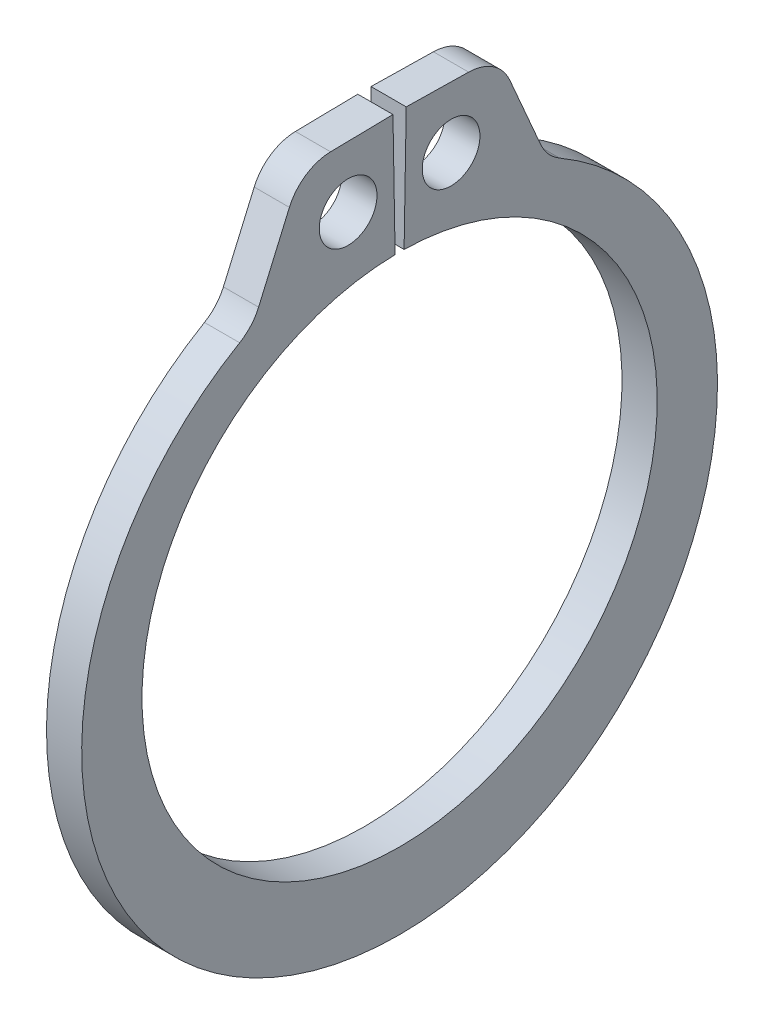
ISO-10303-21;
HEADER;
FILE_DESCRIPTION(('STEP AP214'),'2;1');
FILE_NAME('part.step','',(''),(''),'','','');
FILE_SCHEMA(('AUTOMOTIVE_DESIGN { 1 0 10303 214 1 1 1 1 }'));
ENDSEC;
DATA;
#1=APPLICATION_CONTEXT('core data for automotive mechanical design processes');
#2=APPLICATION_PROTOCOL_DEFINITION('international standard','automotive_design',2000,#1);
#3=PRODUCT_CONTEXT('',#1,'mechanical');
#4=PRODUCT('Part','Part','',(#3));
#5=PRODUCT_RELATED_PRODUCT_CATEGORY('part','',(#4));
#6=PRODUCT_DEFINITION_FORMATION('','',#4);
#7=PRODUCT_DEFINITION_CONTEXT('part definition',#1,'design');
#8=PRODUCT_DEFINITION('design','',#6,#7);
#9=PRODUCT_DEFINITION_SHAPE('','',#8);
#10=(LENGTH_UNIT() NAMED_UNIT(*) SI_UNIT(.MILLI.,.METRE.));
#11=(NAMED_UNIT(*) PLANE_ANGLE_UNIT() SI_UNIT($,.RADIAN.));
#12=(NAMED_UNIT(*) SI_UNIT($,.STERADIAN.) SOLID_ANGLE_UNIT());
#13=UNCERTAINTY_MEASURE_WITH_UNIT(LENGTH_MEASURE(1.E-05),#10,'distance_accuracy_value','');
#14=(GEOMETRIC_REPRESENTATION_CONTEXT(3) GLOBAL_UNCERTAINTY_ASSIGNED_CONTEXT((#13)) GLOBAL_UNIT_ASSIGNED_CONTEXT((#10,
#11,#12)) REPRESENTATION_CONTEXT('',''));
#15=CARTESIAN_POINT('',(0.,0.,0.));
#16=DIRECTION('',(0.,0.,1.));
#17=DIRECTION('',(1.,0.,0.));
#18=AXIS2_PLACEMENT_3D('',#15,#16,#17);
#19=CARTESIAN_POINT('',(0.3175,0.,0.));
#20=DIRECTION('',(1.,0.,0.));
#21=DIRECTION('',(0.,0.,-1.));
#22=AXIS2_PLACEMENT_3D('',#19,#20,#21);
#23=PLANE('',#22);
#24=CARTESIAN_POINT('',(0.3175,5.73776140209981,0.92895422825804));
#25=DIRECTION('',(1.,0.,0.));
#26=DIRECTION('',(0.,0.,-1.));
#27=AXIS2_PLACEMENT_3D('',#24,#25,#26);
#28=CIRCLE('',#27,0.5207);
#29=CARTESIAN_POINT('',(0.3175,5.73776140209981,0.40825422825804));
#30=VERTEX_POINT('',#29);
#31=EDGE_CURVE('E225',#30,#30,#28,.T.);
#32=ORIENTED_EDGE('',*,*,#31,.F.);
#33=EDGE_LOOP('',(#32));
#34=FACE_BOUND('',#33,.T.);
#35=DIRECTION('',(0.,-0.0174524064372746,0.999847695156391));
#36=VECTOR('',#35,1.);
#37=CARTESIAN_POINT('',(0.3175,6.85695549338253,0.11968860334689));
#38=LINE('',#37,#36);
#39=CARTESIAN_POINT('',(0.3175,6.85695549338253,0.11968860334689));
#40=VERTEX_POINT('',#39);
#41=CARTESIAN_POINT('',(0.3175,6.83730746393553,1.24532345648589));
#42=VERTEX_POINT('',#41);
#43=EDGE_CURVE('E137',#40,#42,#38,.T.);
#44=ORIENTED_EDGE('',*,*,#43,.T.);
#45=CARTESIAN_POINT('',(0.3175,6.01193319158393,1.23091649497192));
#46=DIRECTION('',(1.,0.,0.));
#47=DIRECTION('',(0.,0.,-1.));
#48=AXIS2_PLACEMENT_3D('',#45,#46,#47);
#49=CIRCLE('',#48,0.8255);
#50=CARTESIAN_POINT('',(0.3175,6.34036860190848,1.98826742502017));
#51=VERTEX_POINT('',#50);
#52=EDGE_CURVE('E178',#42,#51,#49,.T.);
#53=ORIENTED_EDGE('',*,*,#52,.T.);
#54=DIRECTION('',(0.,-0.917445099997873,0.397862398939498));
#55=VECTOR('',#54,1.);
#56=CARTESIAN_POINT('',(0.3175,6.82803074757371,1.77678618091434));
#57=LINE('',#56,#55);
#58=CARTESIAN_POINT('',(0.3175,5.05860230061111,2.54412260972295));
#59=VERTEX_POINT('',#58);
#60=EDGE_CURVE('E217',#51,#59,#57,.T.);
#61=ORIENTED_EDGE('',*,*,#60,.T.);
#62=CARTESIAN_POINT('',(0.3175,5.38703771093567,3.30147353977119));
#63=DIRECTION('',(1.,0.,0.));
#64=DIRECTION('',(0.,0.,-1.));
#65=AXIS2_PLACEMENT_3D('',#62,#63,#64);
#66=CIRCLE('',#65,0.8255);
#67=CARTESIAN_POINT('',(0.3175,4.6736380727081,2.88612885619287));
#68=VERTEX_POINT('',#67);
#69=EDGE_CURVE('E185',#59,#68,#66,.F.);
#70=ORIENTED_EDGE('',*,*,#69,.T.);
#71=CARTESIAN_POINT('',(0.3175,-0.283601933706637,0.));
#72=DIRECTION('',(1.,0.,0.));
#73=DIRECTION('',(0.,0.,-1.));
#74=AXIS2_PLACEMENT_3D('',#71,#72,#73);
#75=CIRCLE('',#74,5.73619806629338);
#76=CARTESIAN_POINT('',(0.3175,4.6736380727081,-2.88612885619287));
#77=VERTEX_POINT('',#76);
#78=EDGE_CURVE('E210',#68,#77,#75,.T.);
#79=ORIENTED_EDGE('',*,*,#78,.T.);
#80=CARTESIAN_POINT('',(0.3175,5.38703771093567,-3.30147353977119));
#81=DIRECTION('',(1.,0.,0.));
#82=DIRECTION('',(0.,0.,-1.));
#83=AXIS2_PLACEMENT_3D('',#80,#81,#82);
#84=CIRCLE('',#83,0.8255);
#85=CARTESIAN_POINT('',(0.3175,5.05860230061111,-2.54412260972295));
#86=VERTEX_POINT('',#85);
#87=EDGE_CURVE('E11',#77,#86,#84,.F.);
#88=ORIENTED_EDGE('',*,*,#87,.T.);
#89=DIRECTION('',(0.,0.917445099997873,0.397862398939498));
#90=VECTOR('',#89,1.);
#91=CARTESIAN_POINT('',(0.3175,6.82803074757371,-1.77678618091434));
#92=LINE('',#91,#90);
#93=CARTESIAN_POINT('',(0.3175,6.34036860190848,-1.98826742502017));
#94=VERTEX_POINT('',#93);
#95=EDGE_CURVE('E209',#86,#94,#92,.T.);
#96=ORIENTED_EDGE('',*,*,#95,.T.);
#97=CARTESIAN_POINT('',(0.3175,6.01193319158393,-1.23091649497192));
#98=DIRECTION('',(1.,0.,0.));
#99=DIRECTION('',(0.,0.,-1.));
#100=AXIS2_PLACEMENT_3D('',#97,#98,#99);
#101=CIRCLE('',#100,0.8255);
#102=CARTESIAN_POINT('',(0.3175,6.83730746393553,-1.24532345648589));
#103=VERTEX_POINT('',#102);
#104=EDGE_CURVE('E53',#94,#103,#101,.T.);
#105=ORIENTED_EDGE('',*,*,#104,.T.);
#106=DIRECTION('',(0.,0.0174524064372746,0.999847695156391));
#107=VECTOR('',#106,1.);
#108=CARTESIAN_POINT('',(0.3175,6.85695549338253,-0.11968860334689));
#109=LINE('',#108,#107);
#110=CARTESIAN_POINT('',(0.3175,6.85695549338253,-0.11968860334689));
#111=VERTEX_POINT('',#110);
#112=EDGE_CURVE('E214',#103,#111,#109,.T.);
#113=ORIENTED_EDGE('',*,*,#112,.T.);
#114=DIRECTION('',(0.,-0.999847695156391,0.0174524064372834));
#115=VECTOR('',#114,1.);
#116=CARTESIAN_POINT('',(0.3175,4.64749205662594,-0.0811222756017817));
#117=LINE('',#116,#115);
#118=CARTESIAN_POINT('',(0.3175,4.64749205662594,-0.0811222756017817));
#119=VERTEX_POINT('',#118);
#120=EDGE_CURVE('E143',#111,#119,#117,.T.);
#121=ORIENTED_EDGE('',*,*,#120,.T.);
#122=CARTESIAN_POINT('',(0.3175,0.,0.));
#123=DIRECTION('',(-1.,0.,0.));
#124=DIRECTION('',(0.,0.,-1.));
#125=AXIS2_PLACEMENT_3D('',#122,#123,#124);
#126=CIRCLE('',#125,4.64820000000001);
#127=CARTESIAN_POINT('',(0.3175,4.64749205662594,0.0811222756017817));
#128=VERTEX_POINT('',#127);
#129=EDGE_CURVE('E138',#119,#128,#126,.T.);
#130=ORIENTED_EDGE('',*,*,#129,.T.);
#131=DIRECTION('',(0.,0.999847695156391,0.0174524064372834));
#132=VECTOR('',#131,1.);
#133=CARTESIAN_POINT('',(0.3175,4.64749205662594,0.0811222756017817));
#134=LINE('',#133,#132);
#135=EDGE_CURVE('E129',#128,#40,#134,.T.);
#136=ORIENTED_EDGE('',*,*,#135,.T.);
#137=EDGE_LOOP('',(#44,#53,#61,#70,#79,#88,#96,#105,#113,#121,#130,#136));
#138=FACE_BOUND('',#137,.T.);
#139=CARTESIAN_POINT('',(0.3175,5.73776140209981,-0.92895422825804));
#140=DIRECTION('',(1.,0.,0.));
#141=DIRECTION('',(0.,0.,-1.));
#142=AXIS2_PLACEMENT_3D('',#139,#140,#141);
#143=CIRCLE('',#142,0.5207);
#144=CARTESIAN_POINT('',(0.3175,5.73776140209981,-1.44965422825804));
#145=VERTEX_POINT('',#144);
#146=EDGE_CURVE('E251',#145,#145,#143,.T.);
#147=ORIENTED_EDGE('',*,*,#146,.F.);
#148=EDGE_LOOP('',(#147));
#149=FACE_BOUND('',#148,.T.);
#150=ADVANCED_FACE('F38',(#34,#138,#149),#23,.T.);
#151=CARTESIAN_POINT('',(-0.3175,0.,0.));
#152=DIRECTION('',(1.,0.,0.));
#153=DIRECTION('',(0.,0.,-1.));
#154=AXIS2_PLACEMENT_3D('',#151,#152,#153);
#155=PLANE('',#154);
#156=CARTESIAN_POINT('',(-0.3175,5.73776140209981,0.92895422825804));
#157=DIRECTION('',(1.,0.,0.));
#158=DIRECTION('',(0.,0.,-1.));
#159=AXIS2_PLACEMENT_3D('',#156,#157,#158);
#160=CIRCLE('',#159,0.5207);
#161=CARTESIAN_POINT('',(-0.3175,5.73776140209981,0.40825422825804));
#162=VERTEX_POINT('',#161);
#163=EDGE_CURVE('E248',#162,#162,#160,.T.);
#164=ORIENTED_EDGE('',*,*,#163,.T.);
#165=EDGE_LOOP('',(#164));
#166=FACE_BOUND('',#165,.T.);
#167=DIRECTION('',(0.,-0.917445099997873,0.397862398939498));
#168=VECTOR('',#167,1.);
#169=CARTESIAN_POINT('',(-0.3175,6.82803074757371,1.77678618091434));
#170=LINE('',#169,#168);
#171=CARTESIAN_POINT('',(-0.3175,6.34036860190848,1.98826742502017));
#172=VERTEX_POINT('',#171);
#173=CARTESIAN_POINT('',(-0.3175,5.05860230061111,2.54412260972295));
#174=VERTEX_POINT('',#173);
#175=EDGE_CURVE('E204',#172,#174,#170,.T.);
#176=ORIENTED_EDGE('',*,*,#175,.F.);
#177=CARTESIAN_POINT('',(-0.3175,6.01193319158393,1.23091649497192));
#178=DIRECTION('',(1.,0.,0.));
#179=DIRECTION('',(0.,0.,-1.));
#180=AXIS2_PLACEMENT_3D('',#177,#178,#179);
#181=CIRCLE('',#180,0.8255);
#182=CARTESIAN_POINT('',(-0.3175,6.83730746393553,1.24532345648589));
#183=VERTEX_POINT('',#182);
#184=EDGE_CURVE('E174',#172,#183,#181,.F.);
#185=ORIENTED_EDGE('',*,*,#184,.T.);
#186=DIRECTION('',(0.,-0.0174524064372746,0.999847695156391));
#187=VECTOR('',#186,1.);
#188=CARTESIAN_POINT('',(-0.3175,6.85695549338253,0.11968860334689));
#189=LINE('',#188,#187);
#190=CARTESIAN_POINT('',(-0.3175,6.85695549338253,0.11968860334689));
#191=VERTEX_POINT('',#190);
#192=EDGE_CURVE('E227',#191,#183,#189,.T.);
#193=ORIENTED_EDGE('',*,*,#192,.F.);
#194=DIRECTION('',(0.,0.999847695156391,0.0174524064372834));
#195=VECTOR('',#194,1.);
#196=CARTESIAN_POINT('',(-0.3175,4.64749205662594,0.0811222756017817));
#197=LINE('',#196,#195);
#198=CARTESIAN_POINT('',(-0.3175,4.64749205662594,0.0811222756017817));
#199=VERTEX_POINT('',#198);
#200=EDGE_CURVE('E224',#199,#191,#197,.T.);
#201=ORIENTED_EDGE('',*,*,#200,.F.);
#202=CARTESIAN_POINT('',(-0.3175,0.,0.));
#203=DIRECTION('',(-1.,0.,0.));
#204=DIRECTION('',(0.,0.,-1.));
#205=AXIS2_PLACEMENT_3D('',#202,#203,#204);
#206=CIRCLE('',#205,4.64820000000001);
#207=CARTESIAN_POINT('',(-0.3175,4.64749205662594,-0.0811222756017817));
#208=VERTEX_POINT('',#207);
#209=EDGE_CURVE('E151',#208,#199,#206,.T.);
#210=ORIENTED_EDGE('',*,*,#209,.F.);
#211=DIRECTION('',(0.,-0.999847695156391,0.0174524064372834));
#212=VECTOR('',#211,1.);
#213=CARTESIAN_POINT('',(-0.3175,4.64749205662594,-0.0811222756017817));
#214=LINE('',#213,#212);
#215=CARTESIAN_POINT('',(-0.3175,6.85695549338253,-0.11968860334689));
#216=VERTEX_POINT('',#215);
#217=EDGE_CURVE('E147',#216,#208,#214,.T.);
#218=ORIENTED_EDGE('',*,*,#217,.F.);
#219=DIRECTION('',(0.,0.0174524064372746,0.999847695156391));
#220=VECTOR('',#219,1.);
#221=CARTESIAN_POINT('',(-0.3175,6.85695549338253,-0.11968860334689));
#222=LINE('',#221,#220);
#223=CARTESIAN_POINT('',(-0.3175,6.83730746393553,-1.24532345648589));
#224=VERTEX_POINT('',#223);
#225=EDGE_CURVE('E232',#224,#216,#222,.T.);
#226=ORIENTED_EDGE('',*,*,#225,.F.);
#227=CARTESIAN_POINT('',(-0.3175,6.01193319158393,-1.23091649497192));
#228=DIRECTION('',(1.,0.,0.));
#229=DIRECTION('',(0.,0.,-1.));
#230=AXIS2_PLACEMENT_3D('',#227,#228,#229);
#231=CIRCLE('',#230,0.8255);
#232=CARTESIAN_POINT('',(-0.3175,6.34036860190848,-1.98826742502017));
#233=VERTEX_POINT('',#232);
#234=EDGE_CURVE('E172',#224,#233,#231,.F.);
#235=ORIENTED_EDGE('',*,*,#234,.T.);
#236=DIRECTION('',(0.,0.917445099997873,0.397862398939498));
#237=VECTOR('',#236,1.);
#238=CARTESIAN_POINT('',(-0.3175,6.82803074757371,-1.77678618091434));
#239=LINE('',#238,#237);
#240=CARTESIAN_POINT('',(-0.3175,5.05860230061111,-2.54412260972295));
#241=VERTEX_POINT('',#240);
#242=EDGE_CURVE('E195',#241,#233,#239,.T.);
#243=ORIENTED_EDGE('',*,*,#242,.F.);
#244=CARTESIAN_POINT('',(-0.3175,5.38703771093567,-3.30147353977119));
#245=DIRECTION('',(1.,0.,0.));
#246=DIRECTION('',(0.,0.,-1.));
#247=AXIS2_PLACEMENT_3D('',#244,#245,#246);
#248=CIRCLE('',#247,0.8255);
#249=CARTESIAN_POINT('',(-0.3175,4.6736380727081,-2.88612885619287));
#250=VERTEX_POINT('',#249);
#251=EDGE_CURVE('E46',#241,#250,#248,.T.);
#252=ORIENTED_EDGE('',*,*,#251,.T.);
#253=CARTESIAN_POINT('',(-0.3175,-0.283601933706637,0.));
#254=DIRECTION('',(1.,0.,0.));
#255=DIRECTION('',(0.,0.,-1.));
#256=AXIS2_PLACEMENT_3D('',#253,#254,#255);
#257=CIRCLE('',#256,5.73619806629338);
#258=CARTESIAN_POINT('',(-0.3175,4.6736380727081,2.88612885619287));
#259=VERTEX_POINT('',#258);
#260=EDGE_CURVE('E193',#259,#250,#257,.T.);
#261=ORIENTED_EDGE('',*,*,#260,.F.);
#262=CARTESIAN_POINT('',(-0.3175,5.38703771093567,3.30147353977119));
#263=DIRECTION('',(1.,0.,0.));
#264=DIRECTION('',(0.,0.,-1.));
#265=AXIS2_PLACEMENT_3D('',#262,#263,#264);
#266=CIRCLE('',#265,0.8255);
#267=EDGE_CURVE('E183',#259,#174,#266,.T.);
#268=ORIENTED_EDGE('',*,*,#267,.T.);
#269=EDGE_LOOP('',(#176,#185,#193,#201,#210,#218,#226,#235,#243,#252,#261,#268));
#270=FACE_BOUND('',#269,.T.);
#271=CARTESIAN_POINT('',(-0.3175,5.73776140209981,-0.92895422825804));
#272=DIRECTION('',(1.,0.,0.));
#273=DIRECTION('',(0.,0.,-1.));
#274=AXIS2_PLACEMENT_3D('',#271,#272,#273);
#275=CIRCLE('',#274,0.5207);
#276=CARTESIAN_POINT('',(-0.3175,5.73776140209981,-1.44965422825804));
#277=VERTEX_POINT('',#276);
#278=EDGE_CURVE('E254',#277,#277,#275,.T.);
#279=ORIENTED_EDGE('',*,*,#278,.T.);
#280=EDGE_LOOP('',(#279));
#281=FACE_BOUND('',#280,.T.);
#282=ADVANCED_FACE('F191',(#166,#270,#281),#155,.F.);
#283=CARTESIAN_POINT('',(0.3175,0.,0.));
#284=DIRECTION('',(-1.,0.,0.));
#285=DIRECTION('',(0.,0.,1.));
#286=AXIS2_PLACEMENT_3D('',#283,#284,#285);
#287=CYLINDRICAL_SURFACE('',#286,4.64820000000001);
#288=ORIENTED_EDGE('',*,*,#209,.T.);
#289=DIRECTION('',(-1.,0.,0.));
#290=VECTOR('',#289,1.);
#291=CARTESIAN_POINT('',(0.3175,4.64749205662594,0.0811222756017817));
#292=LINE('',#291,#290);
#293=EDGE_CURVE('E133',#128,#199,#292,.T.);
#294=ORIENTED_EDGE('',*,*,#293,.F.);
#295=ORIENTED_EDGE('',*,*,#129,.F.);
#296=DIRECTION('',(-1.,0.,0.));
#297=VECTOR('',#296,1.);
#298=CARTESIAN_POINT('',(0.3175,4.64749205662594,-0.0811222756017817));
#299=LINE('',#298,#297);
#300=EDGE_CURVE('E222',#119,#208,#299,.T.);
#301=ORIENTED_EDGE('',*,*,#300,.T.);
#302=EDGE_LOOP('',(#288,#294,#295,#301));
#303=FACE_BOUND('',#302,.T.);
#304=ADVANCED_FACE('F149',(#303),#287,.F.);
#305=CARTESIAN_POINT('',(0.3175,4.64749205662594,0.0811222756017817));
#306=DIRECTION('',(0.,-0.0174524064372834,0.999847695156391));
#307=DIRECTION('',(0.,-0.999847695156391,-0.0174524064372834));
#308=AXIS2_PLACEMENT_3D('',#305,#306,#307);
#309=PLANE('',#308);
#310=ORIENTED_EDGE('',*,*,#200,.T.);
#311=DIRECTION('',(-1.,0.,0.));
#312=VECTOR('',#311,1.);
#313=CARTESIAN_POINT('',(0.3175,6.85695549338253,0.11968860334689));
#314=LINE('',#313,#312);
#315=EDGE_CURVE('E136',#40,#191,#314,.T.);
#316=ORIENTED_EDGE('',*,*,#315,.F.);
#317=ORIENTED_EDGE('',*,*,#135,.F.);
#318=ORIENTED_EDGE('',*,*,#293,.T.);
#319=EDGE_LOOP('',(#310,#316,#317,#318));
#320=FACE_BOUND('',#319,.T.);
#321=ADVANCED_FACE('F131',(#320),#309,.F.);
#322=CARTESIAN_POINT('',(0.3175,6.85695549338253,0.11968860334689));
#323=DIRECTION('',(0.,-0.999847695156391,-0.0174524064372746));
#324=DIRECTION('',(0.,0.0174524064372746,-0.999847695156391));
#325=AXIS2_PLACEMENT_3D('',#322,#323,#324);
#326=PLANE('',#325);
#327=ORIENTED_EDGE('',*,*,#192,.T.);
#328=DIRECTION('',(-1.,0.,0.));
#329=VECTOR('',#328,1.);
#330=CARTESIAN_POINT('',(0.3175,6.83730746393553,1.24532345648589));
#331=LINE('',#330,#329);
#332=EDGE_CURVE('E61',#183,#42,#331,.F.);
#333=ORIENTED_EDGE('',*,*,#332,.T.);
#334=ORIENTED_EDGE('',*,*,#43,.F.);
#335=ORIENTED_EDGE('',*,*,#315,.T.);
#336=EDGE_LOOP('',(#327,#333,#334,#335));
#337=FACE_BOUND('',#336,.T.);
#338=ADVANCED_FACE('F243',(#337),#326,.F.);
#339=CARTESIAN_POINT('',(0.3175,6.82803074757371,1.77678618091434));
#340=DIRECTION('',(0.,-0.397862398939498,-0.917445099997873));
#341=DIRECTION('',(0.,0.917445099997873,-0.397862398939498));
#342=AXIS2_PLACEMENT_3D('',#339,#340,#341);
#343=PLANE('',#342);
#344=ORIENTED_EDGE('',*,*,#175,.T.);
#345=DIRECTION('',(1.,0.,0.));
#346=VECTOR('',#345,1.);
#347=CARTESIAN_POINT('',(0.3175,5.05860230061111,2.54412260972295));
#348=LINE('',#347,#346);
#349=EDGE_CURVE('E165',#174,#59,#348,.T.);
#350=ORIENTED_EDGE('',*,*,#349,.T.);
#351=ORIENTED_EDGE('',*,*,#60,.F.);
#352=DIRECTION('',(-1.,0.,0.));
#353=VECTOR('',#352,1.);
#354=CARTESIAN_POINT('',(0.3175,6.34036860190848,1.98826742502017));
#355=LINE('',#354,#353);
#356=EDGE_CURVE('E162',#51,#172,#355,.T.);
#357=ORIENTED_EDGE('',*,*,#356,.T.);
#358=EDGE_LOOP('',(#344,#350,#351,#357));
#359=FACE_BOUND('',#358,.T.);
#360=ADVANCED_FACE('F284',(#359),#343,.F.);
#361=CARTESIAN_POINT('',(0.3175,-0.283601933706637,0.));
#362=DIRECTION('',(-1.,0.,0.));
#363=DIRECTION('',(0.,0.,1.));
#364=AXIS2_PLACEMENT_3D('',#361,#362,#363);
#365=CYLINDRICAL_SURFACE('',#364,5.73619806629338);
#366=ORIENTED_EDGE('',*,*,#78,.F.);
#367=DIRECTION('',(-1.,0.,0.));
#368=VECTOR('',#367,1.);
#369=CARTESIAN_POINT('',(0.3175,4.6736380727081,2.88612885619287));
#370=LINE('',#369,#368);
#371=EDGE_CURVE('E154',#68,#259,#370,.T.);
#372=ORIENTED_EDGE('',*,*,#371,.T.);
#373=ORIENTED_EDGE('',*,*,#260,.T.);
#374=DIRECTION('',(-1.,0.,0.));
#375=VECTOR('',#374,1.);
#376=CARTESIAN_POINT('',(0.3175,4.6736380727081,-2.88612885619287));
#377=LINE('',#376,#375);
#378=EDGE_CURVE('E152',#250,#77,#377,.F.);
#379=ORIENTED_EDGE('',*,*,#378,.T.);
#380=EDGE_LOOP('',(#366,#372,#373,#379));
#381=FACE_BOUND('',#380,.T.);
#382=ADVANCED_FACE('F201',(#381),#365,.T.);
#383=CARTESIAN_POINT('',(0.3175,6.82803074757371,-1.77678618091434));
#384=DIRECTION('',(0.,-0.397862398939498,0.917445099997873));
#385=DIRECTION('',(0.,-0.917445099997873,-0.397862398939498));
#386=AXIS2_PLACEMENT_3D('',#383,#384,#385);
#387=PLANE('',#386);
#388=ORIENTED_EDGE('',*,*,#95,.F.);
#389=DIRECTION('',(1.,0.,0.));
#390=VECTOR('',#389,1.);
#391=CARTESIAN_POINT('',(-0.3175,5.05860230061111,-2.54412260972295));
#392=LINE('',#391,#390);
#393=EDGE_CURVE('E169',#86,#241,#392,.F.);
#394=ORIENTED_EDGE('',*,*,#393,.T.);
#395=ORIENTED_EDGE('',*,*,#242,.T.);
#396=DIRECTION('',(-1.,0.,0.));
#397=VECTOR('',#396,1.);
#398=CARTESIAN_POINT('',(0.3175,6.34036860190848,-1.98826742502017));
#399=LINE('',#398,#397);
#400=EDGE_CURVE('E167',#233,#94,#399,.F.);
#401=ORIENTED_EDGE('',*,*,#400,.T.);
#402=EDGE_LOOP('',(#388,#394,#395,#401));
#403=FACE_BOUND('',#402,.T.);
#404=ADVANCED_FACE('F212',(#403),#387,.F.);
#405=CARTESIAN_POINT('',(0.3175,6.85695549338253,-0.11968860334689));
#406=DIRECTION('',(0.,-0.999847695156391,0.0174524064372746));
#407=DIRECTION('',(0.,-0.0174524064372746,-0.999847695156391));
#408=AXIS2_PLACEMENT_3D('',#405,#406,#407);
#409=PLANE('',#408);
#410=ORIENTED_EDGE('',*,*,#112,.F.);
#411=DIRECTION('',(-1.,0.,0.));
#412=VECTOR('',#411,1.);
#413=CARTESIAN_POINT('',(0.3175,6.83730746393553,-1.24532345648589));
#414=LINE('',#413,#412);
#415=EDGE_CURVE('E180',#103,#224,#414,.T.);
#416=ORIENTED_EDGE('',*,*,#415,.T.);
#417=ORIENTED_EDGE('',*,*,#225,.T.);
#418=DIRECTION('',(-1.,0.,0.));
#419=VECTOR('',#418,1.);
#420=CARTESIAN_POINT('',(0.3175,6.85695549338253,-0.11968860334689));
#421=LINE('',#420,#419);
#422=EDGE_CURVE('E156',#111,#216,#421,.T.);
#423=ORIENTED_EDGE('',*,*,#422,.F.);
#424=EDGE_LOOP('',(#410,#416,#417,#423));
#425=FACE_BOUND('',#424,.T.);
#426=ADVANCED_FACE('F277',(#425),#409,.F.);
#427=CARTESIAN_POINT('',(0.3175,4.64749205662594,-0.0811222756017817));
#428=DIRECTION('',(0.,-0.0174524064372834,-0.999847695156391));
#429=DIRECTION('',(0.,0.999847695156391,-0.0174524064372834));
#430=AXIS2_PLACEMENT_3D('',#427,#428,#429);
#431=PLANE('',#430);
#432=ORIENTED_EDGE('',*,*,#217,.T.);
#433=ORIENTED_EDGE('',*,*,#300,.F.);
#434=ORIENTED_EDGE('',*,*,#120,.F.);
#435=ORIENTED_EDGE('',*,*,#422,.T.);
#436=EDGE_LOOP('',(#432,#433,#434,#435));
#437=FACE_BOUND('',#436,.T.);
#438=ADVANCED_FACE('F239',(#437),#431,.F.);
#439=CARTESIAN_POINT('',(0.3175,5.73776140209981,0.92895422825804));
#440=DIRECTION('',(-1.,0.,0.));
#441=DIRECTION('',(0.,0.,1.));
#442=AXIS2_PLACEMENT_3D('',#439,#440,#441);
#443=CYLINDRICAL_SURFACE('',#442,0.5207);
#444=ORIENTED_EDGE('',*,*,#31,.T.);
#445=EDGE_LOOP('',(#444));
#446=FACE_BOUND('',#445,.T.);
#447=ORIENTED_EDGE('',*,*,#163,.F.);
#448=EDGE_LOOP('',(#447));
#449=FACE_BOUND('',#448,.T.);
#450=ADVANCED_FACE('F272',(#446,#449),#443,.F.);
#451=CARTESIAN_POINT('',(0.3175,5.73776140209981,-0.92895422825804));
#452=DIRECTION('',(-1.,0.,0.));
#453=DIRECTION('',(0.,0.,1.));
#454=AXIS2_PLACEMENT_3D('',#451,#452,#453);
#455=CYLINDRICAL_SURFACE('',#454,0.5207);
#456=ORIENTED_EDGE('',*,*,#146,.T.);
#457=EDGE_LOOP('',(#456));
#458=FACE_BOUND('',#457,.T.);
#459=ORIENTED_EDGE('',*,*,#278,.F.);
#460=EDGE_LOOP('',(#459));
#461=FACE_BOUND('',#460,.T.);
#462=ADVANCED_FACE('F260',(#458,#461),#455,.F.);
#463=CARTESIAN_POINT('',(0.3175,5.38703771093567,3.30147353977119));
#464=DIRECTION('',(-1.,0.,0.));
#465=DIRECTION('',(0.,0.,1.));
#466=AXIS2_PLACEMENT_3D('',#463,#464,#465);
#467=CYLINDRICAL_SURFACE('',#466,0.8255);
#468=ORIENTED_EDGE('',*,*,#69,.F.);
#469=ORIENTED_EDGE('',*,*,#349,.F.);
#470=ORIENTED_EDGE('',*,*,#267,.F.);
#471=ORIENTED_EDGE('',*,*,#371,.F.);
#472=EDGE_LOOP('',(#468,#469,#470,#471));
#473=FACE_BOUND('',#472,.T.);
#474=ADVANCED_FACE('F294',(#473),#467,.F.);
#475=CARTESIAN_POINT('',(0.3175,5.38703771093567,-3.30147353977119));
#476=DIRECTION('',(-1.,0.,0.));
#477=DIRECTION('',(0.,0.,1.));
#478=AXIS2_PLACEMENT_3D('',#475,#476,#477);
#479=CYLINDRICAL_SURFACE('',#478,0.8255);
#480=ORIENTED_EDGE('',*,*,#87,.F.);
#481=ORIENTED_EDGE('',*,*,#378,.F.);
#482=ORIENTED_EDGE('',*,*,#251,.F.);
#483=ORIENTED_EDGE('',*,*,#393,.F.);
#484=EDGE_LOOP('',(#480,#481,#482,#483));
#485=FACE_BOUND('',#484,.T.);
#486=ADVANCED_FACE('F207',(#485),#479,.F.);
#487=CARTESIAN_POINT('',(0.3175,6.01193319158393,1.23091649497192));
#488=DIRECTION('',(-1.,0.,0.));
#489=DIRECTION('',(0.,0.,1.));
#490=AXIS2_PLACEMENT_3D('',#487,#488,#489);
#491=CYLINDRICAL_SURFACE('',#490,0.8255);
#492=ORIENTED_EDGE('',*,*,#52,.F.);
#493=ORIENTED_EDGE('',*,*,#332,.F.);
#494=ORIENTED_EDGE('',*,*,#184,.F.);
#495=ORIENTED_EDGE('',*,*,#356,.F.);
#496=EDGE_LOOP('',(#492,#493,#494,#495));
#497=FACE_BOUND('',#496,.T.);
#498=ADVANCED_FACE('F299',(#497),#491,.T.);
#499=CARTESIAN_POINT('',(0.3175,6.01193319158393,-1.23091649497192));
#500=DIRECTION('',(-1.,0.,0.));
#501=DIRECTION('',(0.,0.,1.));
#502=AXIS2_PLACEMENT_3D('',#499,#500,#501);
#503=CYLINDRICAL_SURFACE('',#502,0.8255);
#504=ORIENTED_EDGE('',*,*,#104,.F.);
#505=ORIENTED_EDGE('',*,*,#400,.F.);
#506=ORIENTED_EDGE('',*,*,#234,.F.);
#507=ORIENTED_EDGE('',*,*,#415,.F.);
#508=EDGE_LOOP('',(#504,#505,#506,#507));
#509=FACE_BOUND('',#508,.T.);
#510=ADVANCED_FACE('F40',(#509),#503,.T.);
#511=CLOSED_SHELL('',(#150,#282,#304,#321,#338,#360,#382,#404,#426,#438,#450,#462,#474,#486,
#498,#510));
#512=MANIFOLD_SOLID_BREP('B2',#511);
#513=ADVANCED_BREP_SHAPE_REPRESENTATION('',(#18,#512),#14);
#514=SHAPE_DEFINITION_REPRESENTATION(#9,#513);
ENDSEC;
END-ISO-10303-21;
